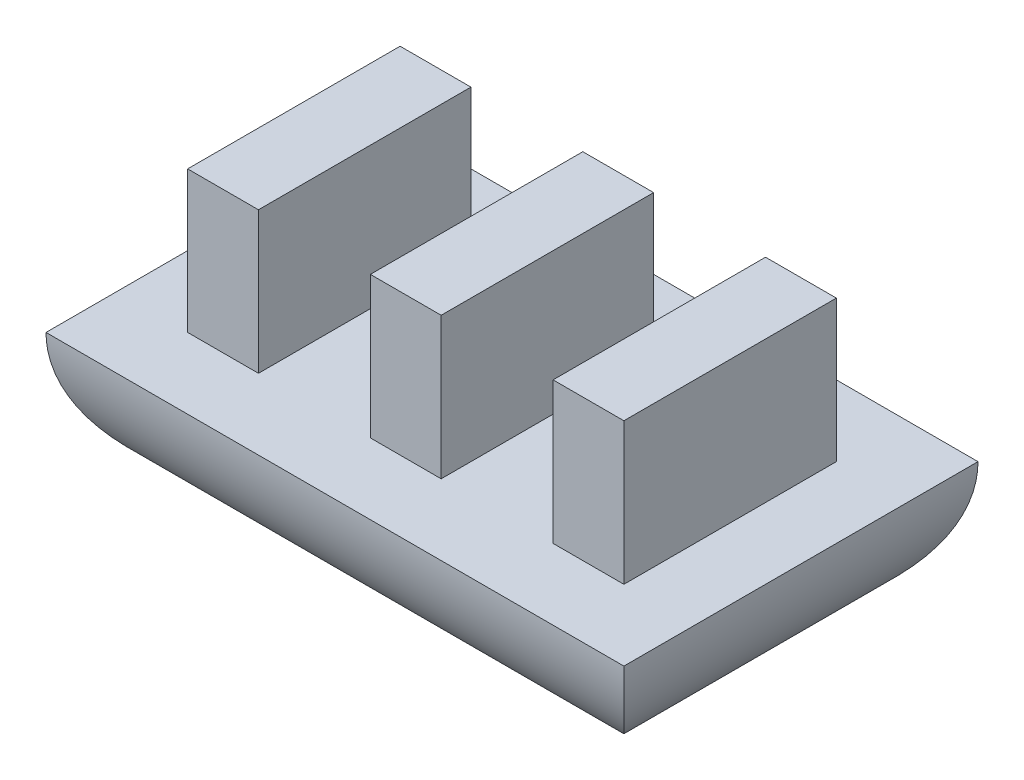
ISO-10303-21;
HEADER;
FILE_DESCRIPTION(('STEP AP214'),'2;1');
FILE_NAME('part.step','',(''),(''),'','','');
FILE_SCHEMA(('AUTOMOTIVE_DESIGN { 1 0 10303 214 1 1 1 1 }'));
ENDSEC;
DATA;
#1=APPLICATION_CONTEXT('core data for automotive mechanical design processes');
#2=APPLICATION_PROTOCOL_DEFINITION('international standard','automotive_design',2000,#1);
#3=PRODUCT_CONTEXT('',#1,'mechanical');
#4=PRODUCT('Part','Part','',(#3));
#5=PRODUCT_RELATED_PRODUCT_CATEGORY('part','',(#4));
#6=PRODUCT_DEFINITION_FORMATION('','',#4);
#7=PRODUCT_DEFINITION_CONTEXT('part definition',#1,'design');
#8=PRODUCT_DEFINITION('design','',#6,#7);
#9=PRODUCT_DEFINITION_SHAPE('','',#8);
#10=(LENGTH_UNIT() NAMED_UNIT(*) SI_UNIT(.MILLI.,.METRE.));
#11=(NAMED_UNIT(*) PLANE_ANGLE_UNIT() SI_UNIT($,.RADIAN.));
#12=(NAMED_UNIT(*) SI_UNIT($,.STERADIAN.) SOLID_ANGLE_UNIT());
#13=UNCERTAINTY_MEASURE_WITH_UNIT(LENGTH_MEASURE(1.E-05),#10,'distance_accuracy_value','');
#14=(GEOMETRIC_REPRESENTATION_CONTEXT(3) GLOBAL_UNCERTAINTY_ASSIGNED_CONTEXT((#13)) GLOBAL_UNIT_ASSIGNED_CONTEXT((#10,
#11,#12)) REPRESENTATION_CONTEXT('',''));
#15=CARTESIAN_POINT('',(0.,0.,0.));
#16=DIRECTION('',(0.,0.,1.));
#17=DIRECTION('',(1.,0.,0.));
#18=AXIS2_PLACEMENT_3D('',#15,#16,#17);
#19=CARTESIAN_POINT('',(0.,0.,0.));
#20=DIRECTION('',(0.,1.,0.));
#21=DIRECTION('',(0.,0.,1.));
#22=AXIS2_PLACEMENT_3D('',#19,#20,#21);
#23=PLANE('',#22);
#24=DIRECTION('',(1.,0.,0.));
#25=VECTOR('',#24,1.);
#26=CARTESIAN_POINT('',(0.,0.,0.));
#27=LINE('',#26,#25);
#28=CARTESIAN_POINT('',(0.,0.,0.));
#29=VERTEX_POINT('',#28);
#30=CARTESIAN_POINT('',(12.954,0.,0.));
#31=VERTEX_POINT('',#30);
#32=EDGE_CURVE('E278',#29,#31,#27,.T.);
#33=ORIENTED_EDGE('',*,*,#32,.T.);
#34=DIRECTION('',(0.,0.,-1.));
#35=VECTOR('',#34,1.);
#36=CARTESIAN_POINT('',(12.954,0.,0.));
#37=LINE('',#36,#35);
#38=CARTESIAN_POINT('',(12.954,0.,-7.9375));
#39=VERTEX_POINT('',#38);
#40=EDGE_CURVE('E281',#31,#39,#37,.T.);
#41=ORIENTED_EDGE('',*,*,#40,.T.);
#42=DIRECTION('',(1.,0.,0.));
#43=VECTOR('',#42,1.);
#44=CARTESIAN_POINT('',(0.,0.,-7.9375));
#45=LINE('',#44,#43);
#46=CARTESIAN_POINT('',(0.,0.,-7.9375));
#47=VERTEX_POINT('',#46);
#48=EDGE_CURVE('E285',#47,#39,#45,.T.);
#49=ORIENTED_EDGE('',*,*,#48,.F.);
#50=DIRECTION('',(0.,0.,-1.));
#51=VECTOR('',#50,1.);
#52=CARTESIAN_POINT('',(0.,0.,0.));
#53=LINE('',#52,#51);
#54=EDGE_CURVE('E289',#29,#47,#53,.T.);
#55=ORIENTED_EDGE('',*,*,#54,.F.);
#56=EDGE_LOOP('',(#33,#41,#49,#55));
#57=FACE_BOUND('',#56,.T.);
#58=DIRECTION('',(0.,0.,-1.));
#59=VECTOR('',#58,1.);
#60=CARTESIAN_POINT('',(3.175,0.,0.));
#61=LINE('',#60,#59);
#62=CARTESIAN_POINT('',(3.175,0.,-1.5875));
#63=VERTEX_POINT('',#62);
#64=CARTESIAN_POINT('',(3.175,0.,-6.35));
#65=VERTEX_POINT('',#64);
#66=EDGE_CURVE('E254',#63,#65,#61,.T.);
#67=ORIENTED_EDGE('',*,*,#66,.F.);
#68=DIRECTION('',(1.,0.,0.));
#69=VECTOR('',#68,1.);
#70=CARTESIAN_POINT('',(0.,0.,-1.5875));
#71=LINE('',#70,#69);
#72=CARTESIAN_POINT('',(1.5875,0.,-1.5875));
#73=VERTEX_POINT('',#72);
#74=EDGE_CURVE('E233',#73,#63,#71,.T.);
#75=ORIENTED_EDGE('',*,*,#74,.F.);
#76=DIRECTION('',(0.,0.,-1.));
#77=VECTOR('',#76,1.);
#78=CARTESIAN_POINT('',(1.5875,0.,0.));
#79=LINE('',#78,#77);
#80=CARTESIAN_POINT('',(1.5875,0.,-6.35));
#81=VERTEX_POINT('',#80);
#82=EDGE_CURVE('E239',#73,#81,#79,.T.);
#83=ORIENTED_EDGE('',*,*,#82,.T.);
#84=DIRECTION('',(1.,0.,0.));
#85=VECTOR('',#84,1.);
#86=CARTESIAN_POINT('',(0.,0.,-6.35));
#87=LINE('',#86,#85);
#88=EDGE_CURVE('E258',#81,#65,#87,.T.);
#89=ORIENTED_EDGE('',*,*,#88,.T.);
#90=EDGE_LOOP('',(#67,#75,#83,#89));
#91=FACE_BOUND('',#90,.T.);
#92=DIRECTION('',(0.,0.,-1.));
#93=VECTOR('',#92,1.);
#94=CARTESIAN_POINT('',(7.27075,0.,0.));
#95=LINE('',#94,#93);
#96=CARTESIAN_POINT('',(7.27075,0.,-1.5875));
#97=VERTEX_POINT('',#96);
#98=CARTESIAN_POINT('',(7.27075,0.,-6.35));
#99=VERTEX_POINT('',#98);
#100=EDGE_CURVE('E187',#97,#99,#95,.T.);
#101=ORIENTED_EDGE('',*,*,#100,.F.);
#102=DIRECTION('',(1.,0.,0.));
#103=VECTOR('',#102,1.);
#104=CARTESIAN_POINT('',(0.,0.,-1.5875));
#105=LINE('',#104,#103);
#106=CARTESIAN_POINT('',(5.68325,0.,-1.5875));
#107=VERTEX_POINT('',#106);
#108=EDGE_CURVE('E182',#107,#97,#105,.T.);
#109=ORIENTED_EDGE('',*,*,#108,.F.);
#110=DIRECTION('',(0.,0.,-1.));
#111=VECTOR('',#110,1.);
#112=CARTESIAN_POINT('',(5.68325,0.,0.));
#113=LINE('',#112,#111);
#114=CARTESIAN_POINT('',(5.68325,0.,-6.35));
#115=VERTEX_POINT('',#114);
#116=EDGE_CURVE('E198',#107,#115,#113,.T.);
#117=ORIENTED_EDGE('',*,*,#116,.T.);
#118=DIRECTION('',(1.,0.,0.));
#119=VECTOR('',#118,1.);
#120=CARTESIAN_POINT('',(0.,0.,-6.35));
#121=LINE('',#120,#119);
#122=EDGE_CURVE('E213',#115,#99,#121,.T.);
#123=ORIENTED_EDGE('',*,*,#122,.T.);
#124=EDGE_LOOP('',(#101,#109,#117,#123));
#125=FACE_BOUND('',#124,.T.);
#126=DIRECTION('',(0.,0.,-1.));
#127=VECTOR('',#126,1.);
#128=CARTESIAN_POINT('',(11.3665,0.,0.));
#129=LINE('',#128,#127);
#130=CARTESIAN_POINT('',(11.3665,0.,-1.5875));
#131=VERTEX_POINT('',#130);
#132=CARTESIAN_POINT('',(11.3665,0.,-6.35));
#133=VERTEX_POINT('',#132);
#134=EDGE_CURVE('E316',#131,#133,#129,.T.);
#135=ORIENTED_EDGE('',*,*,#134,.F.);
#136=DIRECTION('',(1.,0.,0.));
#137=VECTOR('',#136,1.);
#138=CARTESIAN_POINT('',(0.,0.,-1.5875));
#139=LINE('',#138,#137);
#140=CARTESIAN_POINT('',(9.779,0.,-1.5875));
#141=VERTEX_POINT('',#140);
#142=EDGE_CURVE('E180',#141,#131,#139,.T.);
#143=ORIENTED_EDGE('',*,*,#142,.F.);
#144=DIRECTION('',(0.,0.,-1.));
#145=VECTOR('',#144,1.);
#146=CARTESIAN_POINT('',(9.779,0.,0.));
#147=LINE('',#146,#145);
#148=CARTESIAN_POINT('',(9.779,0.,-6.35));
#149=VERTEX_POINT('',#148);
#150=EDGE_CURVE('E177',#141,#149,#147,.T.);
#151=ORIENTED_EDGE('',*,*,#150,.T.);
#152=DIRECTION('',(1.,0.,0.));
#153=VECTOR('',#152,1.);
#154=CARTESIAN_POINT('',(0.,0.,-6.35));
#155=LINE('',#154,#153);
#156=EDGE_CURVE('E319',#149,#133,#155,.T.);
#157=ORIENTED_EDGE('',*,*,#156,.T.);
#158=EDGE_LOOP('',(#135,#143,#151,#157));
#159=FACE_BOUND('',#158,.T.);
#160=ADVANCED_FACE('F39',(#57,#91,#125,#159),#23,.T.);
#161=CARTESIAN_POINT('',(0.,-3.175,0.));
#162=DIRECTION('',(0.,1.,0.));
#163=DIRECTION('',(0.,0.,1.));
#164=AXIS2_PLACEMENT_3D('',#161,#162,#163);
#165=PLANE('',#164);
#166=DIRECTION('',(1.,0.,0.));
#167=VECTOR('',#166,1.);
#168=CARTESIAN_POINT('',(0.,-3.175,-4.7625));
#169=LINE('',#168,#167);
#170=CARTESIAN_POINT('',(3.175,-3.175,-4.7625));
#171=VERTEX_POINT('',#170);
#172=CARTESIAN_POINT('',(9.779,-3.175,-4.7625));
#173=VERTEX_POINT('',#172);
#174=EDGE_CURVE('E49',#171,#173,#169,.T.);
#175=ORIENTED_EDGE('',*,*,#174,.T.);
#176=DIRECTION('',(0.,0.,-1.));
#177=VECTOR('',#176,1.);
#178=CARTESIAN_POINT('',(9.779,-3.175,0.));
#179=LINE('',#178,#177);
#180=CARTESIAN_POINT('',(9.779,-3.175,-3.175));
#181=VERTEX_POINT('',#180);
#182=EDGE_CURVE('E11',#173,#181,#179,.F.);
#183=ORIENTED_EDGE('',*,*,#182,.T.);
#184=DIRECTION('',(1.,0.,0.));
#185=VECTOR('',#184,1.);
#186=CARTESIAN_POINT('',(0.,-3.175,-3.175));
#187=LINE('',#186,#185);
#188=CARTESIAN_POINT('',(3.175,-3.175,-3.175));
#189=VERTEX_POINT('',#188);
#190=EDGE_CURVE('E293',#181,#189,#187,.F.);
#191=ORIENTED_EDGE('',*,*,#190,.T.);
#192=DIRECTION('',(0.,0.,-1.));
#193=VECTOR('',#192,1.);
#194=CARTESIAN_POINT('',(3.175,-3.175,0.));
#195=LINE('',#194,#193);
#196=EDGE_CURVE('E60',#189,#171,#195,.T.);
#197=ORIENTED_EDGE('',*,*,#196,.T.);
#198=EDGE_LOOP('',(#175,#183,#191,#197));
#199=FACE_BOUND('',#198,.T.);
#200=ADVANCED_FACE('F340',(#199),#165,.F.);
#201=CARTESIAN_POINT('',(0.,3.175,-1.5875));
#202=DIRECTION('',(0.,0.,-1.));
#203=DIRECTION('',(-1.,0.,0.));
#204=AXIS2_PLACEMENT_3D('',#201,#202,#203);
#205=PLANE('',#204);
#206=ORIENTED_EDGE('',*,*,#74,.T.);
#207=DIRECTION('',(0.,-1.,0.));
#208=VECTOR('',#207,1.);
#209=CARTESIAN_POINT('',(3.175,3.175,-1.5875));
#210=LINE('',#209,#208);
#211=CARTESIAN_POINT('',(3.175,3.175,-1.5875));
#212=VERTEX_POINT('',#211);
#213=EDGE_CURVE('E274',#212,#63,#210,.T.);
#214=ORIENTED_EDGE('',*,*,#213,.F.);
#215=DIRECTION('',(1.,0.,0.));
#216=VECTOR('',#215,1.);
#217=CARTESIAN_POINT('',(0.,3.175,-1.5875));
#218=LINE('',#217,#216);
#219=CARTESIAN_POINT('',(1.5875,3.175,-1.5875));
#220=VERTEX_POINT('',#219);
#221=EDGE_CURVE('E234',#220,#212,#218,.T.);
#222=ORIENTED_EDGE('',*,*,#221,.F.);
#223=DIRECTION('',(0.,-1.,0.));
#224=VECTOR('',#223,1.);
#225=CARTESIAN_POINT('',(1.5875,3.175,-1.5875));
#226=LINE('',#225,#224);
#227=EDGE_CURVE('E250',#220,#73,#226,.T.);
#228=ORIENTED_EDGE('',*,*,#227,.T.);
#229=EDGE_LOOP('',(#206,#214,#222,#228));
#230=FACE_BOUND('',#229,.T.);
#231=ADVANCED_FACE('F346',(#230),#205,.F.);
#232=CARTESIAN_POINT('',(3.175,3.175,0.));
#233=DIRECTION('',(-1.,0.,0.));
#234=DIRECTION('',(0.,0.,1.));
#235=AXIS2_PLACEMENT_3D('',#232,#233,#234);
#236=PLANE('',#235);
#237=ORIENTED_EDGE('',*,*,#66,.T.);
#238=DIRECTION('',(0.,-1.,0.));
#239=VECTOR('',#238,1.);
#240=CARTESIAN_POINT('',(3.175,3.175,-6.35));
#241=LINE('',#240,#239);
#242=CARTESIAN_POINT('',(3.175,3.175,-6.35));
#243=VERTEX_POINT('',#242);
#244=EDGE_CURVE('E270',#243,#65,#241,.T.);
#245=ORIENTED_EDGE('',*,*,#244,.F.);
#246=DIRECTION('',(0.,0.,-1.));
#247=VECTOR('',#246,1.);
#248=CARTESIAN_POINT('',(3.175,3.175,0.));
#249=LINE('',#248,#247);
#250=EDGE_CURVE('E238',#212,#243,#249,.T.);
#251=ORIENTED_EDGE('',*,*,#250,.F.);
#252=ORIENTED_EDGE('',*,*,#213,.T.);
#253=EDGE_LOOP('',(#237,#245,#251,#252));
#254=FACE_BOUND('',#253,.T.);
#255=ADVANCED_FACE('F412',(#254),#236,.F.);
#256=CARTESIAN_POINT('',(0.,3.175,-6.35));
#257=DIRECTION('',(0.,0.,-1.));
#258=DIRECTION('',(-1.,0.,0.));
#259=AXIS2_PLACEMENT_3D('',#256,#257,#258);
#260=PLANE('',#259);
#261=ORIENTED_EDGE('',*,*,#88,.F.);
#262=DIRECTION('',(0.,-1.,0.));
#263=VECTOR('',#262,1.);
#264=CARTESIAN_POINT('',(1.5875,3.175,-6.35));
#265=LINE('',#264,#263);
#266=CARTESIAN_POINT('',(1.5875,3.175,-6.35));
#267=VERTEX_POINT('',#266);
#268=EDGE_CURVE('E266',#267,#81,#265,.T.);
#269=ORIENTED_EDGE('',*,*,#268,.F.);
#270=DIRECTION('',(1.,0.,0.));
#271=VECTOR('',#270,1.);
#272=CARTESIAN_POINT('',(0.,3.175,-6.35));
#273=LINE('',#272,#271);
#274=EDGE_CURVE('E242',#267,#243,#273,.T.);
#275=ORIENTED_EDGE('',*,*,#274,.T.);
#276=ORIENTED_EDGE('',*,*,#244,.T.);
#277=EDGE_LOOP('',(#261,#269,#275,#276));
#278=FACE_BOUND('',#277,.T.);
#279=ADVANCED_FACE('F408',(#278),#260,.T.);
#280=CARTESIAN_POINT('',(1.5875,3.175,0.));
#281=DIRECTION('',(-1.,0.,0.));
#282=DIRECTION('',(0.,0.,1.));
#283=AXIS2_PLACEMENT_3D('',#280,#281,#282);
#284=PLANE('',#283);
#285=ORIENTED_EDGE('',*,*,#82,.F.);
#286=ORIENTED_EDGE('',*,*,#227,.F.);
#287=DIRECTION('',(0.,0.,-1.));
#288=VECTOR('',#287,1.);
#289=CARTESIAN_POINT('',(1.5875,3.175,0.));
#290=LINE('',#289,#288);
#291=EDGE_CURVE('E246',#220,#267,#290,.T.);
#292=ORIENTED_EDGE('',*,*,#291,.T.);
#293=ORIENTED_EDGE('',*,*,#268,.T.);
#294=EDGE_LOOP('',(#285,#286,#292,#293));
#295=FACE_BOUND('',#294,.T.);
#296=ADVANCED_FACE('F404',(#295),#284,.T.);
#297=CARTESIAN_POINT('',(0.,3.175,0.));
#298=DIRECTION('',(0.,1.,0.));
#299=DIRECTION('',(0.,0.,1.));
#300=AXIS2_PLACEMENT_3D('',#297,#298,#299);
#301=PLANE('',#300);
#302=ORIENTED_EDGE('',*,*,#221,.T.);
#303=ORIENTED_EDGE('',*,*,#250,.T.);
#304=ORIENTED_EDGE('',*,*,#274,.F.);
#305=ORIENTED_EDGE('',*,*,#291,.F.);
#306=EDGE_LOOP('',(#302,#303,#304,#305));
#307=FACE_BOUND('',#306,.T.);
#308=ADVANCED_FACE('F400',(#307),#301,.T.);
#309=CARTESIAN_POINT('',(0.,3.175,-1.5875));
#310=DIRECTION('',(0.,0.,-1.));
#311=DIRECTION('',(-1.,0.,0.));
#312=AXIS2_PLACEMENT_3D('',#309,#310,#311);
#313=PLANE('',#312);
#314=ORIENTED_EDGE('',*,*,#108,.T.);
#315=DIRECTION('',(0.,-1.,0.));
#316=VECTOR('',#315,1.);
#317=CARTESIAN_POINT('',(7.27075,3.175,-1.5875));
#318=LINE('',#317,#316);
#319=CARTESIAN_POINT('',(7.27075,3.175,-1.5875));
#320=VERTEX_POINT('',#319);
#321=EDGE_CURVE('E229',#320,#97,#318,.T.);
#322=ORIENTED_EDGE('',*,*,#321,.F.);
#323=DIRECTION('',(1.,0.,0.));
#324=VECTOR('',#323,1.);
#325=CARTESIAN_POINT('',(0.,3.175,-1.5875));
#326=LINE('',#325,#324);
#327=CARTESIAN_POINT('',(5.68325,3.175,-1.5875));
#328=VERTEX_POINT('',#327);
#329=EDGE_CURVE('E193',#328,#320,#326,.T.);
#330=ORIENTED_EDGE('',*,*,#329,.F.);
#331=DIRECTION('',(0.,-1.,0.));
#332=VECTOR('',#331,1.);
#333=CARTESIAN_POINT('',(5.68325,3.175,-1.5875));
#334=LINE('',#333,#332);
#335=EDGE_CURVE('E208',#328,#107,#334,.T.);
#336=ORIENTED_EDGE('',*,*,#335,.T.);
#337=EDGE_LOOP('',(#314,#322,#330,#336));
#338=FACE_BOUND('',#337,.T.);
#339=ADVANCED_FACE('F396',(#338),#313,.F.);
#340=CARTESIAN_POINT('',(7.27075,3.175,0.));
#341=DIRECTION('',(-1.,0.,0.));
#342=DIRECTION('',(0.,0.,1.));
#343=AXIS2_PLACEMENT_3D('',#340,#341,#342);
#344=PLANE('',#343);
#345=ORIENTED_EDGE('',*,*,#100,.T.);
#346=DIRECTION('',(0.,-1.,0.));
#347=VECTOR('',#346,1.);
#348=CARTESIAN_POINT('',(7.27075,3.175,-6.35));
#349=LINE('',#348,#347);
#350=CARTESIAN_POINT('',(7.27075,3.175,-6.35));
#351=VERTEX_POINT('',#350);
#352=EDGE_CURVE('E225',#351,#99,#349,.T.);
#353=ORIENTED_EDGE('',*,*,#352,.F.);
#354=DIRECTION('',(0.,0.,-1.));
#355=VECTOR('',#354,1.);
#356=CARTESIAN_POINT('',(7.27075,3.175,0.));
#357=LINE('',#356,#355);
#358=EDGE_CURVE('E197',#320,#351,#357,.T.);
#359=ORIENTED_EDGE('',*,*,#358,.F.);
#360=ORIENTED_EDGE('',*,*,#321,.T.);
#361=EDGE_LOOP('',(#345,#353,#359,#360));
#362=FACE_BOUND('',#361,.T.);
#363=ADVANCED_FACE('F392',(#362),#344,.F.);
#364=CARTESIAN_POINT('',(0.,3.175,-6.35));
#365=DIRECTION('',(0.,0.,-1.));
#366=DIRECTION('',(-1.,0.,0.));
#367=AXIS2_PLACEMENT_3D('',#364,#365,#366);
#368=PLANE('',#367);
#369=ORIENTED_EDGE('',*,*,#122,.F.);
#370=DIRECTION('',(0.,-1.,0.));
#371=VECTOR('',#370,1.);
#372=CARTESIAN_POINT('',(5.68325,3.175,-6.35));
#373=LINE('',#372,#371);
#374=CARTESIAN_POINT('',(5.68325,3.175,-6.35));
#375=VERTEX_POINT('',#374);
#376=EDGE_CURVE('E221',#375,#115,#373,.T.);
#377=ORIENTED_EDGE('',*,*,#376,.F.);
#378=DIRECTION('',(1.,0.,0.));
#379=VECTOR('',#378,1.);
#380=CARTESIAN_POINT('',(0.,3.175,-6.35));
#381=LINE('',#380,#379);
#382=EDGE_CURVE('E201',#375,#351,#381,.T.);
#383=ORIENTED_EDGE('',*,*,#382,.T.);
#384=ORIENTED_EDGE('',*,*,#352,.T.);
#385=EDGE_LOOP('',(#369,#377,#383,#384));
#386=FACE_BOUND('',#385,.T.);
#387=ADVANCED_FACE('F388',(#386),#368,.T.);
#388=CARTESIAN_POINT('',(5.68325,3.175,0.));
#389=DIRECTION('',(-1.,0.,0.));
#390=DIRECTION('',(0.,0.,1.));
#391=AXIS2_PLACEMENT_3D('',#388,#389,#390);
#392=PLANE('',#391);
#393=ORIENTED_EDGE('',*,*,#116,.F.);
#394=ORIENTED_EDGE('',*,*,#335,.F.);
#395=DIRECTION('',(0.,0.,-1.));
#396=VECTOR('',#395,1.);
#397=CARTESIAN_POINT('',(5.68325,3.175,0.));
#398=LINE('',#397,#396);
#399=EDGE_CURVE('E205',#328,#375,#398,.T.);
#400=ORIENTED_EDGE('',*,*,#399,.T.);
#401=ORIENTED_EDGE('',*,*,#376,.T.);
#402=EDGE_LOOP('',(#393,#394,#400,#401));
#403=FACE_BOUND('',#402,.T.);
#404=ADVANCED_FACE('F384',(#403),#392,.T.);
#405=CARTESIAN_POINT('',(0.,3.175,0.));
#406=DIRECTION('',(0.,1.,0.));
#407=DIRECTION('',(0.,0.,1.));
#408=AXIS2_PLACEMENT_3D('',#405,#406,#407);
#409=PLANE('',#408);
#410=ORIENTED_EDGE('',*,*,#329,.T.);
#411=ORIENTED_EDGE('',*,*,#358,.T.);
#412=ORIENTED_EDGE('',*,*,#382,.F.);
#413=ORIENTED_EDGE('',*,*,#399,.F.);
#414=EDGE_LOOP('',(#410,#411,#412,#413));
#415=FACE_BOUND('',#414,.T.);
#416=ADVANCED_FACE('F381',(#415),#409,.T.);
#417=CARTESIAN_POINT('',(0.,3.175,-1.5875));
#418=DIRECTION('',(0.,0.,-1.));
#419=DIRECTION('',(-1.,0.,0.));
#420=AXIS2_PLACEMENT_3D('',#417,#418,#419);
#421=PLANE('',#420);
#422=ORIENTED_EDGE('',*,*,#142,.T.);
#423=DIRECTION('',(0.,-1.,0.));
#424=VECTOR('',#423,1.);
#425=CARTESIAN_POINT('',(11.3665,3.175,-1.5875));
#426=LINE('',#425,#424);
#427=CARTESIAN_POINT('',(11.3665,3.175,-1.5875));
#428=VERTEX_POINT('',#427);
#429=EDGE_CURVE('E158',#428,#131,#426,.T.);
#430=ORIENTED_EDGE('',*,*,#429,.F.);
#431=DIRECTION('',(1.,0.,0.));
#432=VECTOR('',#431,1.);
#433=CARTESIAN_POINT('',(0.,3.175,-1.5875));
#434=LINE('',#433,#432);
#435=CARTESIAN_POINT('',(9.779,3.175,-1.5875));
#436=VERTEX_POINT('',#435);
#437=EDGE_CURVE('E167',#436,#428,#434,.T.);
#438=ORIENTED_EDGE('',*,*,#437,.F.);
#439=DIRECTION('',(0.,-1.,0.));
#440=VECTOR('',#439,1.);
#441=CARTESIAN_POINT('',(9.779,3.175,-1.5875));
#442=LINE('',#441,#440);
#443=EDGE_CURVE('E328',#436,#141,#442,.T.);
#444=ORIENTED_EDGE('',*,*,#443,.T.);
#445=EDGE_LOOP('',(#422,#430,#438,#444));
#446=FACE_BOUND('',#445,.T.);
#447=ADVANCED_FACE('F179',(#446),#421,.F.);
#448=CARTESIAN_POINT('',(11.3665,3.175,0.));
#449=DIRECTION('',(-1.,0.,0.));
#450=DIRECTION('',(0.,0.,1.));
#451=AXIS2_PLACEMENT_3D('',#448,#449,#450);
#452=PLANE('',#451);
#453=ORIENTED_EDGE('',*,*,#134,.T.);
#454=DIRECTION('',(0.,-1.,0.));
#455=VECTOR('',#454,1.);
#456=CARTESIAN_POINT('',(11.3665,3.175,-6.35));
#457=LINE('',#456,#455);
#458=CARTESIAN_POINT('',(11.3665,3.175,-6.35));
#459=VERTEX_POINT('',#458);
#460=EDGE_CURVE('E161',#459,#133,#457,.T.);
#461=ORIENTED_EDGE('',*,*,#460,.F.);
#462=DIRECTION('',(0.,0.,-1.));
#463=VECTOR('',#462,1.);
#464=CARTESIAN_POINT('',(11.3665,3.175,0.));
#465=LINE('',#464,#463);
#466=EDGE_CURVE('E153',#428,#459,#465,.T.);
#467=ORIENTED_EDGE('',*,*,#466,.F.);
#468=ORIENTED_EDGE('',*,*,#429,.T.);
#469=EDGE_LOOP('',(#453,#461,#467,#468));
#470=FACE_BOUND('',#469,.T.);
#471=ADVANCED_FACE('F156',(#470),#452,.F.);
#472=CARTESIAN_POINT('',(0.,3.175,-6.35));
#473=DIRECTION('',(0.,0.,-1.));
#474=DIRECTION('',(-1.,0.,0.));
#475=AXIS2_PLACEMENT_3D('',#472,#473,#474);
#476=PLANE('',#475);
#477=ORIENTED_EDGE('',*,*,#156,.F.);
#478=DIRECTION('',(0.,-1.,0.));
#479=VECTOR('',#478,1.);
#480=CARTESIAN_POINT('',(9.779,3.175,-6.35));
#481=LINE('',#480,#479);
#482=CARTESIAN_POINT('',(9.779,3.175,-6.35));
#483=VERTEX_POINT('',#482);
#484=EDGE_CURVE('E189',#483,#149,#481,.T.);
#485=ORIENTED_EDGE('',*,*,#484,.F.);
#486=DIRECTION('',(1.,0.,0.));
#487=VECTOR('',#486,1.);
#488=CARTESIAN_POINT('',(0.,3.175,-6.35));
#489=LINE('',#488,#487);
#490=EDGE_CURVE('E166',#483,#459,#489,.T.);
#491=ORIENTED_EDGE('',*,*,#490,.T.);
#492=ORIENTED_EDGE('',*,*,#460,.T.);
#493=EDGE_LOOP('',(#477,#485,#491,#492));
#494=FACE_BOUND('',#493,.T.);
#495=ADVANCED_FACE('F337',(#494),#476,.T.);
#496=CARTESIAN_POINT('',(9.779,3.175,0.));
#497=DIRECTION('',(-1.,0.,0.));
#498=DIRECTION('',(0.,0.,1.));
#499=AXIS2_PLACEMENT_3D('',#496,#497,#498);
#500=PLANE('',#499);
#501=ORIENTED_EDGE('',*,*,#150,.F.);
#502=ORIENTED_EDGE('',*,*,#443,.F.);
#503=DIRECTION('',(0.,0.,-1.));
#504=VECTOR('',#503,1.);
#505=CARTESIAN_POINT('',(9.779,3.175,0.));
#506=LINE('',#505,#504);
#507=EDGE_CURVE('E173',#436,#483,#506,.T.);
#508=ORIENTED_EDGE('',*,*,#507,.T.);
#509=ORIENTED_EDGE('',*,*,#484,.T.);
#510=EDGE_LOOP('',(#501,#502,#508,#509));
#511=FACE_BOUND('',#510,.T.);
#512=ADVANCED_FACE('F335',(#511),#500,.T.);
#513=CARTESIAN_POINT('',(0.,3.175,0.));
#514=DIRECTION('',(0.,1.,0.));
#515=DIRECTION('',(0.,0.,1.));
#516=AXIS2_PLACEMENT_3D('',#513,#514,#515);
#517=PLANE('',#516);
#518=ORIENTED_EDGE('',*,*,#437,.T.);
#519=ORIENTED_EDGE('',*,*,#466,.T.);
#520=ORIENTED_EDGE('',*,*,#490,.F.);
#521=ORIENTED_EDGE('',*,*,#507,.F.);
#522=EDGE_LOOP('',(#518,#519,#520,#521));
#523=FACE_BOUND('',#522,.T.);
#524=ADVANCED_FACE('F171',(#523),#517,.T.);
#525=CARTESIAN_POINT('',(3.175,0.,0.));
#526=DIRECTION('',(0.,0.,-1.));
#527=DIRECTION('',(-1.,0.,0.));
#528=AXIS2_PLACEMENT_3D('',#525,#526,#527);
#529=CYLINDRICAL_SURFACE('',#528,3.175);
#530=CARTESIAN_POINT('',(3.175,0.,-4.7625));
#531=DIRECTION('',(0.707106781186547,0.,-0.707106781186547));
#532=DIRECTION('',(-0.707106781186547,0.,-0.707106781186547));
#533=AXIS2_PLACEMENT_3D('',#530,#531,#532);
#534=ELLIPSE('',#533,4.49012806053458,3.175);
#535=EDGE_CURVE('E305',#171,#47,#534,.T.);
#536=ORIENTED_EDGE('',*,*,#535,.F.);
#537=ORIENTED_EDGE('',*,*,#196,.F.);
#538=CARTESIAN_POINT('',(3.175,0.,-3.175));
#539=DIRECTION('',(-0.707106781186547,0.,-0.707106781186548));
#540=DIRECTION('',(-0.707106781186548,0.,0.707106781186547));
#541=AXIS2_PLACEMENT_3D('',#538,#539,#540);
#542=ELLIPSE('',#541,4.49012806053458,3.175);
#543=EDGE_CURVE('E43',#29,#189,#542,.F.);
#544=ORIENTED_EDGE('',*,*,#543,.F.);
#545=ORIENTED_EDGE('',*,*,#54,.T.);
#546=EDGE_LOOP('',(#536,#537,#544,#545));
#547=FACE_BOUND('',#546,.T.);
#548=ADVANCED_FACE('F41',(#547),#529,.T.);
#549=CARTESIAN_POINT('',(0.,0.,-3.175));
#550=DIRECTION('',(-1.,0.,0.));
#551=DIRECTION('',(0.,0.,1.));
#552=AXIS2_PLACEMENT_3D('',#549,#550,#551);
#553=CYLINDRICAL_SURFACE('',#552,3.175);
#554=ORIENTED_EDGE('',*,*,#543,.T.);
#555=ORIENTED_EDGE('',*,*,#190,.F.);
#556=CARTESIAN_POINT('',(9.779,0.,-3.175));
#557=DIRECTION('',(-0.707106781186548,0.,0.707106781186547));
#558=DIRECTION('',(-0.707106781186547,0.,-0.707106781186548));
#559=AXIS2_PLACEMENT_3D('',#556,#557,#558);
#560=ELLIPSE('',#559,4.49012806053458,3.175);
#561=EDGE_CURVE('E303',#31,#181,#560,.F.);
#562=ORIENTED_EDGE('',*,*,#561,.F.);
#563=ORIENTED_EDGE('',*,*,#32,.F.);
#564=EDGE_LOOP('',(#554,#555,#562,#563));
#565=FACE_BOUND('',#564,.T.);
#566=ADVANCED_FACE('F357',(#565),#553,.T.);
#567=CARTESIAN_POINT('',(0.,0.,-4.7625));
#568=DIRECTION('',(1.,0.,0.));
#569=DIRECTION('',(0.,0.,-1.));
#570=AXIS2_PLACEMENT_3D('',#567,#568,#569);
#571=CYLINDRICAL_SURFACE('',#570,3.175);
#572=ORIENTED_EDGE('',*,*,#535,.T.);
#573=ORIENTED_EDGE('',*,*,#48,.T.);
#574=CARTESIAN_POINT('',(9.779,0.,-4.7625));
#575=DIRECTION('',(0.707106781186547,0.,0.707106781186547));
#576=DIRECTION('',(0.707106781186547,0.,-0.707106781186547));
#577=AXIS2_PLACEMENT_3D('',#574,#575,#576);
#578=ELLIPSE('',#577,4.49012806053458,3.175);
#579=EDGE_CURVE('E300',#173,#39,#578,.T.);
#580=ORIENTED_EDGE('',*,*,#579,.F.);
#581=ORIENTED_EDGE('',*,*,#174,.F.);
#582=EDGE_LOOP('',(#572,#573,#580,#581));
#583=FACE_BOUND('',#582,.T.);
#584=ADVANCED_FACE('F354',(#583),#571,.T.);
#585=CARTESIAN_POINT('',(9.779,0.,0.));
#586=DIRECTION('',(0.,0.,1.));
#587=DIRECTION('',(1.,0.,0.));
#588=AXIS2_PLACEMENT_3D('',#585,#586,#587);
#589=CYLINDRICAL_SURFACE('',#588,3.175);
#590=ORIENTED_EDGE('',*,*,#561,.T.);
#591=ORIENTED_EDGE('',*,*,#182,.F.);
#592=ORIENTED_EDGE('',*,*,#579,.T.);
#593=ORIENTED_EDGE('',*,*,#40,.F.);
#594=EDGE_LOOP('',(#590,#591,#592,#593));
#595=FACE_BOUND('',#594,.T.);
#596=ADVANCED_FACE('F351',(#595),#589,.T.);
#597=CLOSED_SHELL('',(#160,#200,#231,#255,#279,#296,#308,#339,#363,#387,#404,#416,#447,#471,
#495,#512,#524,#548,#566,#584,#596));
#598=MANIFOLD_SOLID_BREP('B2',#597);
#599=ADVANCED_BREP_SHAPE_REPRESENTATION('',(#18,#598),#14);
#600=SHAPE_DEFINITION_REPRESENTATION(#9,#599);
ENDSEC;
END-ISO-10303-21;
